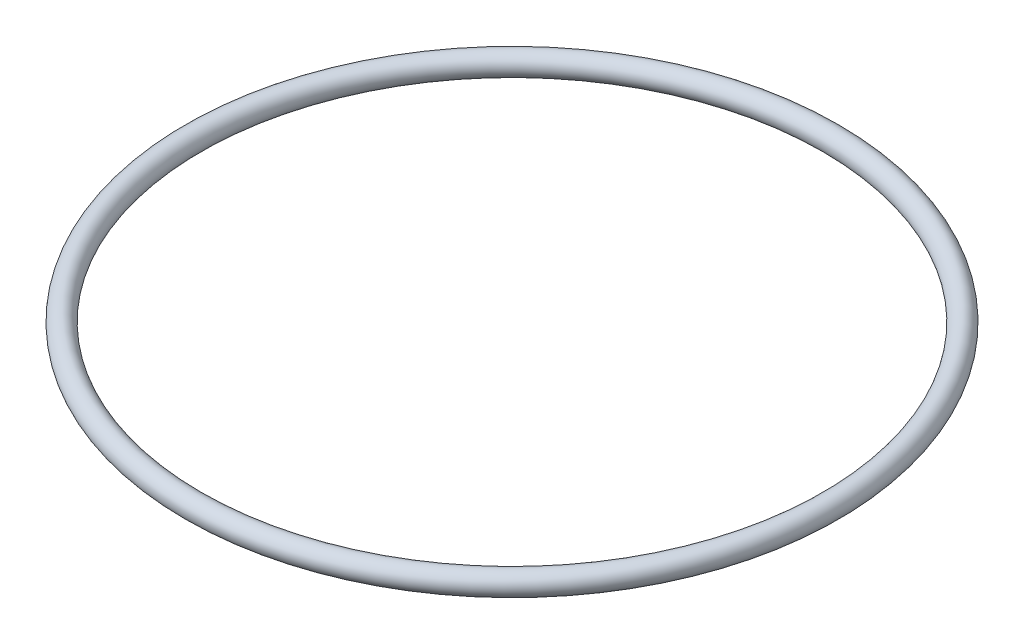
ISO-10303-21;
HEADER;
FILE_DESCRIPTION(('STEP AP214'),'2;1');
FILE_NAME('part.step','',(''),(''),'','','');
FILE_SCHEMA(('AUTOMOTIVE_DESIGN { 1 0 10303 214 1 1 1 1 }'));
ENDSEC;
DATA;
#1=APPLICATION_CONTEXT('core data for automotive mechanical design processes');
#2=APPLICATION_PROTOCOL_DEFINITION('international standard','automotive_design',2000,#1);
#3=PRODUCT_CONTEXT('',#1,'mechanical');
#4=PRODUCT('Part','Part','',(#3));
#5=PRODUCT_RELATED_PRODUCT_CATEGORY('part','',(#4));
#6=PRODUCT_DEFINITION_FORMATION('','',#4);
#7=PRODUCT_DEFINITION_CONTEXT('part definition',#1,'design');
#8=PRODUCT_DEFINITION('design','',#6,#7);
#9=PRODUCT_DEFINITION_SHAPE('','',#8);
#10=(LENGTH_UNIT() NAMED_UNIT(*) SI_UNIT(.MILLI.,.METRE.));
#11=(NAMED_UNIT(*) PLANE_ANGLE_UNIT() SI_UNIT($,.RADIAN.));
#12=(NAMED_UNIT(*) SI_UNIT($,.STERADIAN.) SOLID_ANGLE_UNIT());
#13=UNCERTAINTY_MEASURE_WITH_UNIT(LENGTH_MEASURE(1.E-05),#10,'distance_accuracy_value','');
#14=(GEOMETRIC_REPRESENTATION_CONTEXT(3) GLOBAL_UNCERTAINTY_ASSIGNED_CONTEXT((#13)) GLOBAL_UNIT_ASSIGNED_CONTEXT((#10,
#11,#12)) REPRESENTATION_CONTEXT('',''));
#15=CARTESIAN_POINT('',(0.,0.,0.));
#16=DIRECTION('',(0.,0.,1.));
#17=DIRECTION('',(1.,0.,0.));
#18=AXIS2_PLACEMENT_3D('',#15,#16,#17);
#19=CARTESIAN_POINT('',(0.,0.,0.));
#20=DIRECTION('',(0.,1.,0.));
#21=DIRECTION('',(0.,0.,1.));
#22=AXIS2_PLACEMENT_3D('',#19,#20,#21);
#23=TOROIDAL_SURFACE('',#22,50.9524,1.76529999999999);
#24=CARTESIAN_POINT('',(0.,0.,52.7177));
#25=VERTEX_POINT('',#24);
#26=VERTEX_LOOP('',#25);
#27=FACE_BOUND('',#26,.T.);
#28=ADVANCED_FACE('F31',(#27),#23,.T.);
#29=CLOSED_SHELL('',(#28));
#30=MANIFOLD_SOLID_BREP('B2',#29);
#31=ADVANCED_BREP_SHAPE_REPRESENTATION('',(#18,#30),#14);
#32=SHAPE_DEFINITION_REPRESENTATION(#9,#31);
ENDSEC;
END-ISO-10303-21;
